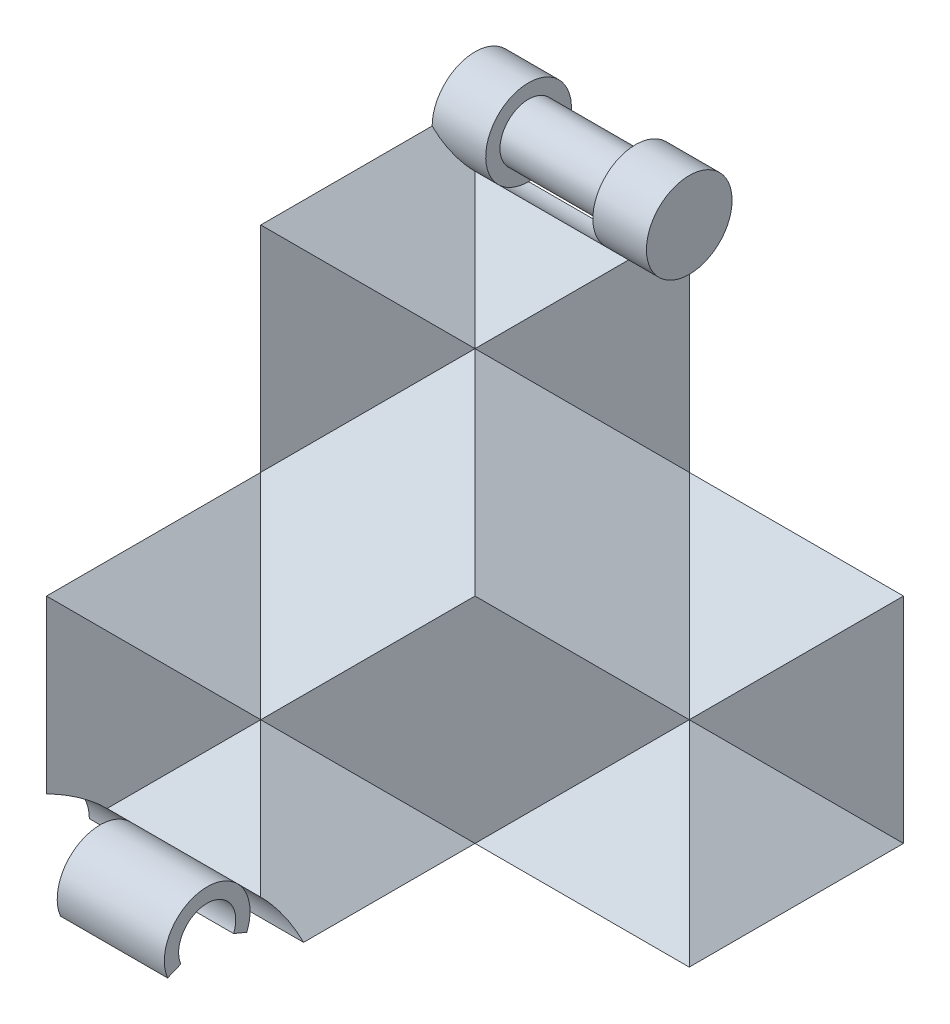
ISO-10303-21;
HEADER;
FILE_DESCRIPTION(('STEP AP214'),'2;1');
FILE_NAME('part.step','',(''),(''),'','','');
FILE_SCHEMA(('AUTOMOTIVE_DESIGN { 1 0 10303 214 1 1 1 1 }'));
ENDSEC;
DATA;
#1=APPLICATION_CONTEXT('core data for automotive mechanical design processes');
#2=APPLICATION_PROTOCOL_DEFINITION('international standard','automotive_design',2000,#1);
#3=PRODUCT_CONTEXT('',#1,'mechanical');
#4=PRODUCT('Part','Part','',(#3));
#5=PRODUCT_RELATED_PRODUCT_CATEGORY('part','',(#4));
#6=PRODUCT_DEFINITION_FORMATION('','',#4);
#7=PRODUCT_DEFINITION_CONTEXT('part definition',#1,'design');
#8=PRODUCT_DEFINITION('design','',#6,#7);
#9=PRODUCT_DEFINITION_SHAPE('','',#8);
#10=(LENGTH_UNIT() NAMED_UNIT(*) SI_UNIT(.MILLI.,.METRE.));
#11=(NAMED_UNIT(*) PLANE_ANGLE_UNIT() SI_UNIT($,.RADIAN.));
#12=(NAMED_UNIT(*) SI_UNIT($,.STERADIAN.) SOLID_ANGLE_UNIT());
#13=UNCERTAINTY_MEASURE_WITH_UNIT(LENGTH_MEASURE(1.E-05),#10,'distance_accuracy_value','');
#14=(GEOMETRIC_REPRESENTATION_CONTEXT(3) GLOBAL_UNCERTAINTY_ASSIGNED_CONTEXT((#13)) GLOBAL_UNIT_ASSIGNED_CONTEXT((#10,
#11,#12)) REPRESENTATION_CONTEXT('',''));
#15=CARTESIAN_POINT('',(0.,0.,0.));
#16=DIRECTION('',(0.,0.,1.));
#17=DIRECTION('',(1.,0.,0.));
#18=AXIS2_PLACEMENT_3D('',#15,#16,#17);
#19=CARTESIAN_POINT('',(0.,0.,0.));
#20=DIRECTION('',(0.,0.,-1.));
#21=DIRECTION('',(-1.,0.,0.));
#22=AXIS2_PLACEMENT_3D('',#19,#20,#21);
#23=PLANE('',#22);
#24=DIRECTION('',(-1.,0.,0.));
#25=VECTOR('',#24,1.);
#26=CARTESIAN_POINT('',(25.063807345283,34.29,0.));
#27=LINE('',#26,#25);
#28=CARTESIAN_POINT('',(4.7625,34.29,0.));
#29=VERTEX_POINT('',#28);
#30=CARTESIAN_POINT('',(14.2875,34.29,0.));
#31=VERTEX_POINT('',#30);
#32=EDGE_CURVE('E842',#29,#31,#27,.F.);
#33=ORIENTED_EDGE('',*,*,#32,.T.);
#34=DIRECTION('',(-1.,0.,0.));
#35=VECTOR('',#34,1.);
#36=CARTESIAN_POINT('',(19.05,34.29,0.));
#37=LINE('',#36,#35);
#38=CARTESIAN_POINT('',(19.05,34.29,0.));
#39=VERTEX_POINT('',#38);
#40=EDGE_CURVE('E69',#31,#39,#37,.F.);
#41=ORIENTED_EDGE('',*,*,#40,.T.);
#42=DIRECTION('',(0.,1.,0.));
#43=VECTOR('',#42,1.);
#44=CARTESIAN_POINT('',(19.05,19.05,0.));
#45=LINE('',#44,#43);
#46=CARTESIAN_POINT('',(19.05,19.05,0.));
#47=VERTEX_POINT('',#46);
#48=EDGE_CURVE('E224',#47,#39,#45,.T.);
#49=ORIENTED_EDGE('',*,*,#48,.F.);
#50=DIRECTION('',(-1.,0.,0.));
#51=VECTOR('',#50,1.);
#52=CARTESIAN_POINT('',(19.05,19.05,0.));
#53=LINE('',#52,#51);
#54=CARTESIAN_POINT('',(38.1,19.05,0.));
#55=VERTEX_POINT('',#54);
#56=EDGE_CURVE('E239',#55,#47,#53,.T.);
#57=ORIENTED_EDGE('',*,*,#56,.F.);
#58=DIRECTION('',(0.,1.,0.));
#59=VECTOR('',#58,1.);
#60=CARTESIAN_POINT('',(38.1,0.,0.));
#61=LINE('',#60,#59);
#62=CARTESIAN_POINT('',(38.1,0.,0.));
#63=VERTEX_POINT('',#62);
#64=EDGE_CURVE('E235',#63,#55,#61,.T.);
#65=ORIENTED_EDGE('',*,*,#64,.F.);
#66=DIRECTION('',(1.,0.,0.));
#67=VECTOR('',#66,1.);
#68=CARTESIAN_POINT('',(0.,0.,0.));
#69=LINE('',#68,#67);
#70=CARTESIAN_POINT('',(0.,0.,0.));
#71=VERTEX_POINT('',#70);
#72=EDGE_CURVE('E276',#71,#63,#69,.T.);
#73=ORIENTED_EDGE('',*,*,#72,.F.);
#74=DIRECTION('',(0.,-1.,0.));
#75=VECTOR('',#74,1.);
#76=CARTESIAN_POINT('',(0.,0.,0.));
#77=LINE('',#76,#75);
#78=CARTESIAN_POINT('',(0.,34.29,0.));
#79=VERTEX_POINT('',#78);
#80=EDGE_CURVE('E273',#79,#71,#77,.T.);
#81=ORIENTED_EDGE('',*,*,#80,.F.);
#82=DIRECTION('',(-1.,0.,0.));
#83=VECTOR('',#82,1.);
#84=CARTESIAN_POINT('',(15.538807345283,34.29,0.));
#85=LINE('',#84,#83);
#86=EDGE_CURVE('E188',#79,#29,#85,.F.);
#87=ORIENTED_EDGE('',*,*,#86,.T.);
#88=EDGE_LOOP('',(#33,#41,#49,#57,#65,#73,#81,#87));
#89=FACE_BOUND('',#88,.T.);
#90=ADVANCED_FACE('F45',(#89),#23,.T.);
#91=CARTESIAN_POINT('',(0.,38.1,0.));
#92=DIRECTION('',(0.,0.707106781186546,0.707106781186549));
#93=DIRECTION('',(0.,-0.707106781186549,0.707106781186546));
#94=AXIS2_PLACEMENT_3D('',#91,#92,#93);
#95=PLANE('',#94);
#96=DIRECTION('',(-1.,0.,0.));
#97=VECTOR('',#96,1.);
#98=CARTESIAN_POINT('',(19.05,35.4059231636793,2.69407683632078));
#99=LINE('',#98,#97);
#100=CARTESIAN_POINT('',(14.2875,35.4059231636793,2.69407683632077));
#101=VERTEX_POINT('',#100);
#102=CARTESIAN_POINT('',(16.3559231636792,35.4059231636793,2.69407683632078));
#103=VERTEX_POINT('',#102);
#104=EDGE_CURVE('E822',#101,#103,#99,.F.);
#105=ORIENTED_EDGE('',*,*,#104,.F.);
#106=DIRECTION('',(-1.,0.,0.));
#107=VECTOR('',#106,1.);
#108=CARTESIAN_POINT('',(25.063807345283,35.4059231636793,2.69407683632077));
#109=LINE('',#108,#107);
#110=CARTESIAN_POINT('',(4.7625,35.4059231636793,2.69407683632077));
#111=VERTEX_POINT('',#110);
#112=EDGE_CURVE('E11',#111,#101,#109,.F.);
#113=ORIENTED_EDGE('',*,*,#112,.F.);
#114=DIRECTION('',(-1.,0.,0.));
#115=VECTOR('',#114,1.);
#116=CARTESIAN_POINT('',(15.538807345283,35.4059231636793,2.69407683632078));
#117=LINE('',#116,#115);
#118=CARTESIAN_POINT('',(2.69407683632075,35.4059231636793,2.69407683632078));
#119=VERTEX_POINT('',#118);
#120=EDGE_CURVE('E203',#119,#111,#117,.F.);
#121=ORIENTED_EDGE('',*,*,#120,.F.);
#122=DIRECTION('',(-0.577350269189627,0.577350269189627,-0.577350269189624));
#123=VECTOR('',#122,1.);
#124=CARTESIAN_POINT('',(6.35000000000001,31.75,6.35000000000003));
#125=LINE('',#124,#123);
#126=CARTESIAN_POINT('',(9.525,28.575,9.525));
#127=VERTEX_POINT('',#126);
#128=EDGE_CURVE('E201',#127,#119,#125,.T.);
#129=ORIENTED_EDGE('',*,*,#128,.F.);
#130=DIRECTION('',(0.577350269189627,0.577350269189627,-0.577350269189624));
#131=VECTOR('',#130,1.);
#132=CARTESIAN_POINT('',(12.7,31.75,6.35000000000003));
#133=LINE('',#132,#131);
#134=EDGE_CURVE('E210',#127,#103,#133,.T.);
#135=ORIENTED_EDGE('',*,*,#134,.T.);
#136=EDGE_LOOP('',(#105,#113,#121,#129,#135));
#137=FACE_BOUND('',#136,.T.);
#138=ADVANCED_FACE('F425',(#137),#95,.T.);
#139=CARTESIAN_POINT('',(19.05,19.05,0.));
#140=DIRECTION('',(0.707106781186546,0.,0.707106781186549));
#141=DIRECTION('',(0.707106781186549,0.,-0.707106781186546));
#142=AXIS2_PLACEMENT_3D('',#139,#140,#141);
#143=PLANE('',#142);
#144=CARTESIAN_POINT('',(19.05,38.1,0.));
#145=DIRECTION('',(0.707106781186546,0.,0.707106781186549));
#146=DIRECTION('',(-0.707106781186549,0.,0.707106781186546));
#147=AXIS2_PLACEMENT_3D('',#144,#145,#146);
#148=ELLIPSE('',#147,5.3881536726415,3.81);
#149=EDGE_CURVE('E61',#103,#39,#148,.T.);
#150=ORIENTED_EDGE('',*,*,#149,.F.);
#151=ORIENTED_EDGE('',*,*,#134,.F.);
#152=DIRECTION('',(0.577350269189627,-0.577350269189626,-0.577350269189625));
#153=VECTOR('',#152,1.);
#154=CARTESIAN_POINT('',(12.7,25.4000000000001,6.35000000000003));
#155=LINE('',#154,#153);
#156=EDGE_CURVE('E215',#127,#47,#155,.T.);
#157=ORIENTED_EDGE('',*,*,#156,.T.);
#158=ORIENTED_EDGE('',*,*,#48,.T.);
#159=EDGE_LOOP('',(#150,#151,#157,#158));
#160=FACE_BOUND('',#159,.T.);
#161=ADVANCED_FACE('F428',(#160),#143,.T.);
#162=CARTESIAN_POINT('',(0.,38.1,19.05));
#163=DIRECTION('',(0.707106781186549,0.707106781186546,0.));
#164=DIRECTION('',(0.707106781186546,-0.707106781186549,0.));
#165=AXIS2_PLACEMENT_3D('',#162,#163,#164);
#166=PLANE('',#165);
#167=CARTESIAN_POINT('',(0.,38.1,0.));
#168=DIRECTION('',(0.707106781186549,0.707106781186546,0.));
#169=DIRECTION('',(-0.707106781186546,0.707106781186549,0.));
#170=AXIS2_PLACEMENT_3D('',#167,#168,#169);
#171=ELLIPSE('',#170,5.38815367264148,3.81);
#172=CARTESIAN_POINT('',(0.,38.1,3.81000000000003));
#173=VERTEX_POINT('',#172);
#174=EDGE_CURVE('E185',#173,#119,#171,.T.);
#175=ORIENTED_EDGE('',*,*,#174,.F.);
#176=DIRECTION('',(0.,0.,1.));
#177=VECTOR('',#176,1.);
#178=CARTESIAN_POINT('',(0.,38.1,19.05));
#179=LINE('',#178,#177);
#180=CARTESIAN_POINT('',(0.,38.1,19.05));
#181=VERTEX_POINT('',#180);
#182=EDGE_CURVE('E198',#173,#181,#179,.T.);
#183=ORIENTED_EDGE('',*,*,#182,.T.);
#184=DIRECTION('',(-0.577350269189622,0.577350269189627,0.577350269189629));
#185=VECTOR('',#184,1.);
#186=CARTESIAN_POINT('',(6.35000000000004,31.75,12.7));
#187=LINE('',#186,#185);
#188=EDGE_CURVE('E240',#127,#181,#187,.T.);
#189=ORIENTED_EDGE('',*,*,#188,.F.);
#190=ORIENTED_EDGE('',*,*,#128,.T.);
#191=EDGE_LOOP('',(#175,#183,#189,#190));
#192=FACE_BOUND('',#191,.T.);
#193=ADVANCED_FACE('F197',(#192),#166,.T.);
#194=CARTESIAN_POINT('',(0.,0.,38.1));
#195=DIRECTION('',(0.,0.707106781186551,0.707106781186544));
#196=DIRECTION('',(0.,-0.707106781186544,0.707106781186551));
#197=AXIS2_PLACEMENT_3D('',#194,#195,#196);
#198=PLANE('',#197);
#199=DIRECTION('',(-1.,0.,0.));
#200=VECTOR('',#199,1.);
#201=CARTESIAN_POINT('',(19.05,2.6940768363208,35.4059231636792));
#202=LINE('',#201,#200);
#203=CARTESIAN_POINT('',(16.3559231636793,2.6940768363208,35.4059231636792));
#204=VERTEX_POINT('',#203);
#205=CARTESIAN_POINT('',(14.2875,2.69407683632081,35.4059231636792));
#206=VERTEX_POINT('',#205);
#207=EDGE_CURVE('E413',#204,#206,#202,.T.);
#208=ORIENTED_EDGE('',*,*,#207,.F.);
#209=DIRECTION('',(0.577350269189627,-0.577350269189622,0.577350269189629));
#210=VECTOR('',#209,1.);
#211=CARTESIAN_POINT('',(19.05,0.,38.1));
#212=LINE('',#211,#210);
#213=CARTESIAN_POINT('',(9.525,9.525,28.575));
#214=VERTEX_POINT('',#213);
#215=EDGE_CURVE('E294',#214,#204,#212,.T.);
#216=ORIENTED_EDGE('',*,*,#215,.F.);
#217=DIRECTION('',(-0.577350269189627,-0.577350269189622,0.577350269189629));
#218=VECTOR('',#217,1.);
#219=CARTESIAN_POINT('',(0.,0.,38.1));
#220=LINE('',#219,#218);
#221=CARTESIAN_POINT('',(2.69407683632077,2.69407683632082,35.4059231636792));
#222=VERTEX_POINT('',#221);
#223=EDGE_CURVE('E300',#214,#222,#220,.T.);
#224=ORIENTED_EDGE('',*,*,#223,.T.);
#225=DIRECTION('',(-1.,0.,0.));
#226=VECTOR('',#225,1.);
#227=CARTESIAN_POINT('',(15.538807345283,2.6940768363208,35.4059231636792));
#228=LINE('',#227,#226);
#229=CARTESIAN_POINT('',(4.7625,2.69407683632081,35.4059231636792));
#230=VERTEX_POINT('',#229);
#231=EDGE_CURVE('E873',#230,#222,#228,.T.);
#232=ORIENTED_EDGE('',*,*,#231,.F.);
#233=DIRECTION('',(-1.,0.,0.));
#234=VECTOR('',#233,1.);
#235=CARTESIAN_POINT('',(14.2875,2.6940768363208,35.4059231636792));
#236=LINE('',#235,#234);
#237=EDGE_CURVE('E229',#206,#230,#236,.T.);
#238=ORIENTED_EDGE('',*,*,#237,.F.);
#239=EDGE_LOOP('',(#208,#216,#224,#232,#238));
#240=FACE_BOUND('',#239,.T.);
#241=ADVANCED_FACE('F412',(#240),#198,.T.);
#242=CARTESIAN_POINT('',(0.,0.,38.1));
#243=DIRECTION('',(0.,-1.,0.));
#244=DIRECTION('',(-1.,0.,0.));
#245=AXIS2_PLACEMENT_3D('',#242,#243,#244);
#246=PLANE('',#245);
#247=DIRECTION('',(0.,0.,-1.));
#248=VECTOR('',#247,1.);
#249=CARTESIAN_POINT('',(19.05,0.,38.1));
#250=LINE('',#249,#248);
#251=CARTESIAN_POINT('',(19.05,0.,34.29));
#252=VERTEX_POINT('',#251);
#253=CARTESIAN_POINT('',(19.05,0.,19.05));
#254=VERTEX_POINT('',#253);
#255=EDGE_CURVE('E284',#252,#254,#250,.T.);
#256=ORIENTED_EDGE('',*,*,#255,.F.);
#257=DIRECTION('',(-1.,0.,0.));
#258=VECTOR('',#257,1.);
#259=CARTESIAN_POINT('',(19.05,0.,34.29));
#260=LINE('',#259,#258);
#261=CARTESIAN_POINT('',(14.2875,0.,34.29));
#262=VERTEX_POINT('',#261);
#263=EDGE_CURVE('E326',#252,#262,#260,.T.);
#264=ORIENTED_EDGE('',*,*,#263,.T.);
#265=DIRECTION('',(-1.,0.,0.));
#266=VECTOR('',#265,1.);
#267=CARTESIAN_POINT('',(14.2875,0.,34.29));
#268=LINE('',#267,#266);
#269=CARTESIAN_POINT('',(4.7625,0.,34.29));
#270=VERTEX_POINT('',#269);
#271=EDGE_CURVE('E54',#262,#270,#268,.T.);
#272=ORIENTED_EDGE('',*,*,#271,.T.);
#273=DIRECTION('',(-1.,0.,0.));
#274=VECTOR('',#273,1.);
#275=CARTESIAN_POINT('',(15.538807345283,0.,34.29));
#276=LINE('',#275,#274);
#277=CARTESIAN_POINT('',(0.,0.,34.29));
#278=VERTEX_POINT('',#277);
#279=EDGE_CURVE('E325',#270,#278,#276,.T.);
#280=ORIENTED_EDGE('',*,*,#279,.T.);
#281=DIRECTION('',(0.,0.,1.));
#282=VECTOR('',#281,1.);
#283=CARTESIAN_POINT('',(0.,0.,38.1));
#284=LINE('',#283,#282);
#285=EDGE_CURVE('E290',#71,#278,#284,.T.);
#286=ORIENTED_EDGE('',*,*,#285,.F.);
#287=ORIENTED_EDGE('',*,*,#72,.T.);
#288=DIRECTION('',(0.,0.,-1.));
#289=VECTOR('',#288,1.);
#290=CARTESIAN_POINT('',(38.1,0.,19.05));
#291=LINE('',#290,#289);
#292=CARTESIAN_POINT('',(38.1,0.,19.05));
#293=VERTEX_POINT('',#292);
#294=EDGE_CURVE('E248',#293,#63,#291,.T.);
#295=ORIENTED_EDGE('',*,*,#294,.F.);
#296=DIRECTION('',(1.,0.,0.));
#297=VECTOR('',#296,1.);
#298=CARTESIAN_POINT('',(19.05,0.,19.05));
#299=LINE('',#298,#297);
#300=EDGE_CURVE('E255',#254,#293,#299,.T.);
#301=ORIENTED_EDGE('',*,*,#300,.F.);
#302=EDGE_LOOP('',(#256,#264,#272,#280,#286,#287,#295,#301));
#303=FACE_BOUND('',#302,.T.);
#304=ADVANCED_FACE('F323',(#303),#246,.T.);
#305=CARTESIAN_POINT('',(19.05,0.,38.1));
#306=DIRECTION('',(0.707106781186546,0.707106781186549,0.));
#307=DIRECTION('',(0.707106781186549,-0.707106781186546,0.));
#308=AXIS2_PLACEMENT_3D('',#305,#306,#307);
#309=PLANE('',#308);
#310=CARTESIAN_POINT('',(19.05,0.,38.1));
#311=DIRECTION('',(0.707106781186546,0.707106781186549,0.));
#312=DIRECTION('',(-0.707106781186549,0.707106781186546,0.));
#313=AXIS2_PLACEMENT_3D('',#310,#311,#312);
#314=ELLIPSE('',#313,5.3881536726415,3.81);
#315=EDGE_CURVE('E858',#252,#204,#314,.T.);
#316=ORIENTED_EDGE('',*,*,#315,.F.);
#317=ORIENTED_EDGE('',*,*,#255,.T.);
#318=DIRECTION('',(0.577350269189627,-0.577350269189626,-0.577350269189625));
#319=VECTOR('',#318,1.);
#320=CARTESIAN_POINT('',(12.7,6.35000000000002,25.4));
#321=LINE('',#320,#319);
#322=EDGE_CURVE('E295',#214,#254,#321,.T.);
#323=ORIENTED_EDGE('',*,*,#322,.F.);
#324=ORIENTED_EDGE('',*,*,#215,.T.);
#325=EDGE_LOOP('',(#316,#317,#323,#324));
#326=FACE_BOUND('',#325,.T.);
#327=ADVANCED_FACE('F416',(#326),#309,.T.);
#328=CARTESIAN_POINT('',(0.,0.,38.1));
#329=DIRECTION('',(0.707106781186551,0.,0.707106781186544));
#330=DIRECTION('',(0.707106781186544,0.,-0.707106781186551));
#331=AXIS2_PLACEMENT_3D('',#328,#329,#330);
#332=PLANE('',#331);
#333=CARTESIAN_POINT('',(0.,0.,38.1));
#334=DIRECTION('',(0.707106781186551,0.,0.707106781186544));
#335=DIRECTION('',(-0.707106781186544,0.,0.707106781186551));
#336=AXIS2_PLACEMENT_3D('',#333,#334,#335);
#337=ELLIPSE('',#336,5.38815367264147,3.81);
#338=CARTESIAN_POINT('',(0.,3.81000000000007,38.1));
#339=VERTEX_POINT('',#338);
#340=EDGE_CURVE('E407',#222,#339,#337,.T.);
#341=ORIENTED_EDGE('',*,*,#340,.F.);
#342=ORIENTED_EDGE('',*,*,#223,.F.);
#343=DIRECTION('',(-0.577350269189622,0.577350269189627,0.577350269189629));
#344=VECTOR('',#343,1.);
#345=CARTESIAN_POINT('',(6.35000000000004,12.7,31.75));
#346=LINE('',#345,#344);
#347=CARTESIAN_POINT('',(0.,19.05,38.1));
#348=VERTEX_POINT('',#347);
#349=EDGE_CURVE('E314',#214,#348,#346,.T.);
#350=ORIENTED_EDGE('',*,*,#349,.T.);
#351=DIRECTION('',(0.,-1.,0.));
#352=VECTOR('',#351,1.);
#353=CARTESIAN_POINT('',(0.,0.,38.1));
#354=LINE('',#353,#352);
#355=EDGE_CURVE('E310',#348,#339,#354,.T.);
#356=ORIENTED_EDGE('',*,*,#355,.T.);
#357=EDGE_LOOP('',(#341,#342,#350,#356));
#358=FACE_BOUND('',#357,.T.);
#359=ADVANCED_FACE('F406',(#358),#332,.T.);
#360=CARTESIAN_POINT('',(19.05,0.,19.05));
#361=DIRECTION('',(0.707106781186546,0.,0.707106781186549));
#362=DIRECTION('',(0.707106781186549,0.,-0.707106781186546));
#363=AXIS2_PLACEMENT_3D('',#360,#361,#362);
#364=PLANE('',#363);
#365=ORIENTED_EDGE('',*,*,#322,.T.);
#366=DIRECTION('',(-0.577350269189627,-0.577350269189622,0.577350269189629));
#367=VECTOR('',#366,1.);
#368=CARTESIAN_POINT('',(19.05,0.,19.05));
#369=LINE('',#368,#367);
#370=CARTESIAN_POINT('',(28.575,9.525,9.525));
#371=VERTEX_POINT('',#370);
#372=EDGE_CURVE('E265',#371,#254,#369,.T.);
#373=ORIENTED_EDGE('',*,*,#372,.F.);
#374=DIRECTION('',(-0.577350269189622,0.577350269189627,0.577350269189629));
#375=VECTOR('',#374,1.);
#376=CARTESIAN_POINT('',(25.4000000000001,12.7,12.7));
#377=LINE('',#376,#375);
#378=CARTESIAN_POINT('',(19.05,19.05,19.05));
#379=VERTEX_POINT('',#378);
#380=EDGE_CURVE('E264',#371,#379,#377,.T.);
#381=ORIENTED_EDGE('',*,*,#380,.T.);
#382=DIRECTION('',(0.577350269189627,0.577350269189627,-0.577350269189624));
#383=VECTOR('',#382,1.);
#384=CARTESIAN_POINT('',(12.7,12.7,25.4));
#385=LINE('',#384,#383);
#386=EDGE_CURVE('E280',#214,#379,#385,.T.);
#387=ORIENTED_EDGE('',*,*,#386,.F.);
#388=EDGE_LOOP('',(#365,#373,#381,#387));
#389=FACE_BOUND('',#388,.T.);
#390=ADVANCED_FACE('F419',(#389),#364,.T.);
#391=CARTESIAN_POINT('',(0.,19.05,19.05));
#392=DIRECTION('',(0.,0.707106781186546,0.707106781186549));
#393=DIRECTION('',(0.,-0.707106781186549,0.707106781186546));
#394=AXIS2_PLACEMENT_3D('',#391,#392,#393);
#395=PLANE('',#394);
#396=ORIENTED_EDGE('',*,*,#386,.T.);
#397=DIRECTION('',(0.577350269189627,-0.577350269189622,0.577350269189629));
#398=VECTOR('',#397,1.);
#399=CARTESIAN_POINT('',(19.05,19.0500000000001,19.05));
#400=LINE('',#399,#398);
#401=EDGE_CURVE('E225',#127,#379,#400,.T.);
#402=ORIENTED_EDGE('',*,*,#401,.F.);
#403=DIRECTION('',(-0.577350269189627,-0.577350269189622,0.577350269189629));
#404=VECTOR('',#403,1.);
#405=CARTESIAN_POINT('',(0.,19.0500000000001,19.05));
#406=LINE('',#405,#404);
#407=CARTESIAN_POINT('',(0.,19.05,19.05));
#408=VERTEX_POINT('',#407);
#409=EDGE_CURVE('E220',#127,#408,#406,.T.);
#410=ORIENTED_EDGE('',*,*,#409,.T.);
#411=DIRECTION('',(-0.577350269189627,0.577350269189627,-0.577350269189624));
#412=VECTOR('',#411,1.);
#413=CARTESIAN_POINT('',(6.35000000000002,12.7,25.4));
#414=LINE('',#413,#412);
#415=EDGE_CURVE('E279',#214,#408,#414,.T.);
#416=ORIENTED_EDGE('',*,*,#415,.F.);
#417=EDGE_LOOP('',(#396,#402,#410,#416));
#418=FACE_BOUND('',#417,.T.);
#419=ADVANCED_FACE('F396',(#418),#395,.T.);
#420=CARTESIAN_POINT('',(0.,19.05,38.1));
#421=DIRECTION('',(0.707106781186549,0.707106781186546,0.));
#422=DIRECTION('',(0.707106781186546,-0.707106781186549,0.));
#423=AXIS2_PLACEMENT_3D('',#420,#421,#422);
#424=PLANE('',#423);
#425=DIRECTION('',(0.,0.,1.));
#426=VECTOR('',#425,1.);
#427=CARTESIAN_POINT('',(0.,19.05,38.1));
#428=LINE('',#427,#426);
#429=EDGE_CURVE('E299',#408,#348,#428,.T.);
#430=ORIENTED_EDGE('',*,*,#429,.T.);
#431=ORIENTED_EDGE('',*,*,#349,.F.);
#432=ORIENTED_EDGE('',*,*,#415,.T.);
#433=EDGE_LOOP('',(#430,#431,#432));
#434=FACE_BOUND('',#433,.T.);
#435=ADVANCED_FACE('F47',(#434),#424,.T.);
#436=CARTESIAN_POINT('',(0.,0.,38.1));
#437=DIRECTION('',(-1.,0.,0.));
#438=DIRECTION('',(0.,0.,1.));
#439=AXIS2_PLACEMENT_3D('',#436,#437,#438);
#440=PLANE('',#439);
#441=CARTESIAN_POINT('',(0.,38.1,0.));
#442=DIRECTION('',(1.,0.,0.));
#443=DIRECTION('',(0.,0.,-1.));
#444=AXIS2_PLACEMENT_3D('',#441,#442,#443);
#445=CIRCLE('',#444,3.81);
#446=EDGE_CURVE('E182',#79,#173,#445,.T.);
#447=ORIENTED_EDGE('',*,*,#446,.F.);
#448=ORIENTED_EDGE('',*,*,#80,.T.);
#449=ORIENTED_EDGE('',*,*,#285,.T.);
#450=CARTESIAN_POINT('',(0.,0.,38.1));
#451=DIRECTION('',(1.,0.,0.));
#452=DIRECTION('',(0.,0.,-1.));
#453=AXIS2_PLACEMENT_3D('',#450,#451,#452);
#454=CIRCLE('',#453,3.81);
#455=EDGE_CURVE('E865',#278,#339,#454,.T.);
#456=ORIENTED_EDGE('',*,*,#455,.T.);
#457=ORIENTED_EDGE('',*,*,#355,.F.);
#458=ORIENTED_EDGE('',*,*,#429,.F.);
#459=DIRECTION('',(0.,-1.,0.));
#460=VECTOR('',#459,1.);
#461=CARTESIAN_POINT('',(0.,19.05,19.05));
#462=LINE('',#461,#460);
#463=EDGE_CURVE('E208',#181,#408,#462,.T.);
#464=ORIENTED_EDGE('',*,*,#463,.F.);
#465=ORIENTED_EDGE('',*,*,#182,.F.);
#466=EDGE_LOOP('',(#447,#448,#449,#456,#457,#458,#464,#465));
#467=FACE_BOUND('',#466,.T.);
#468=ADVANCED_FACE('F206',(#467),#440,.T.);
#469=CARTESIAN_POINT('',(38.1,0.,19.05));
#470=DIRECTION('',(0.707106781186546,0.707106781186549,0.));
#471=DIRECTION('',(0.707106781186549,-0.707106781186546,0.));
#472=AXIS2_PLACEMENT_3D('',#469,#470,#471);
#473=PLANE('',#472);
#474=ORIENTED_EDGE('',*,*,#294,.T.);
#475=DIRECTION('',(0.577350269189627,-0.577350269189626,-0.577350269189625));
#476=VECTOR('',#475,1.);
#477=CARTESIAN_POINT('',(31.75,6.35000000000002,6.35000000000003));
#478=LINE('',#477,#476);
#479=EDGE_CURVE('E260',#371,#63,#478,.T.);
#480=ORIENTED_EDGE('',*,*,#479,.F.);
#481=DIRECTION('',(0.577350269189627,-0.577350269189622,0.577350269189629));
#482=VECTOR('',#481,1.);
#483=CARTESIAN_POINT('',(38.1,0.,19.05));
#484=LINE('',#483,#482);
#485=EDGE_CURVE('E259',#371,#293,#484,.T.);
#486=ORIENTED_EDGE('',*,*,#485,.T.);
#487=EDGE_LOOP('',(#474,#480,#486));
#488=FACE_BOUND('',#487,.T.);
#489=ADVANCED_FACE('F456',(#488),#473,.T.);
#490=CARTESIAN_POINT('',(19.05,0.,19.05));
#491=DIRECTION('',(0.,0.707106781186551,0.707106781186544));
#492=DIRECTION('',(0.,-0.707106781186544,0.707106781186551));
#493=AXIS2_PLACEMENT_3D('',#490,#491,#492);
#494=PLANE('',#493);
#495=ORIENTED_EDGE('',*,*,#300,.T.);
#496=ORIENTED_EDGE('',*,*,#485,.F.);
#497=ORIENTED_EDGE('',*,*,#372,.T.);
#498=EDGE_LOOP('',(#495,#496,#497));
#499=FACE_BOUND('',#498,.T.);
#500=ADVANCED_FACE('F488',(#499),#494,.T.);
#501=CARTESIAN_POINT('',(38.1,0.,0.));
#502=DIRECTION('',(0.707106781186546,0.,0.707106781186549));
#503=DIRECTION('',(0.707106781186549,0.,-0.707106781186546));
#504=AXIS2_PLACEMENT_3D('',#501,#502,#503);
#505=PLANE('',#504);
#506=ORIENTED_EDGE('',*,*,#64,.T.);
#507=DIRECTION('',(0.577350269189627,0.577350269189627,-0.577350269189624));
#508=VECTOR('',#507,1.);
#509=CARTESIAN_POINT('',(31.75,12.7,6.35000000000003));
#510=LINE('',#509,#508);
#511=EDGE_CURVE('E244',#371,#55,#510,.T.);
#512=ORIENTED_EDGE('',*,*,#511,.F.);
#513=ORIENTED_EDGE('',*,*,#479,.T.);
#514=EDGE_LOOP('',(#506,#512,#513));
#515=FACE_BOUND('',#514,.T.);
#516=ADVANCED_FACE('F495',(#515),#505,.T.);
#517=CARTESIAN_POINT('',(19.05,19.05,0.));
#518=DIRECTION('',(0.,0.707106781186546,0.707106781186549));
#519=DIRECTION('',(0.,-0.707106781186549,0.707106781186546));
#520=AXIS2_PLACEMENT_3D('',#517,#518,#519);
#521=PLANE('',#520);
#522=ORIENTED_EDGE('',*,*,#56,.T.);
#523=DIRECTION('',(-0.577350269189627,0.577350269189627,-0.577350269189624));
#524=VECTOR('',#523,1.);
#525=CARTESIAN_POINT('',(25.4000000000001,12.7,6.35000000000003));
#526=LINE('',#525,#524);
#527=EDGE_CURVE('E243',#371,#47,#526,.T.);
#528=ORIENTED_EDGE('',*,*,#527,.F.);
#529=ORIENTED_EDGE('',*,*,#511,.T.);
#530=EDGE_LOOP('',(#522,#528,#529));
#531=FACE_BOUND('',#530,.T.);
#532=ADVANCED_FACE('F501',(#531),#521,.T.);
#533=CARTESIAN_POINT('',(19.0500000000001,19.05,19.05));
#534=DIRECTION('',(0.707106781186549,0.707106781186546,0.));
#535=DIRECTION('',(0.707106781186546,-0.707106781186549,0.));
#536=AXIS2_PLACEMENT_3D('',#533,#534,#535);
#537=PLANE('',#536);
#538=ORIENTED_EDGE('',*,*,#527,.T.);
#539=ORIENTED_EDGE('',*,*,#156,.F.);
#540=ORIENTED_EDGE('',*,*,#401,.T.);
#541=ORIENTED_EDGE('',*,*,#380,.F.);
#542=EDGE_LOOP('',(#538,#539,#540,#541));
#543=FACE_BOUND('',#542,.T.);
#544=ADVANCED_FACE('F422',(#543),#537,.T.);
#545=CARTESIAN_POINT('',(0.,19.05,19.05));
#546=DIRECTION('',(0.707106781186551,0.,0.707106781186544));
#547=DIRECTION('',(0.707106781186544,0.,-0.707106781186551));
#548=AXIS2_PLACEMENT_3D('',#545,#546,#547);
#549=PLANE('',#548);
#550=ORIENTED_EDGE('',*,*,#463,.T.);
#551=ORIENTED_EDGE('',*,*,#409,.F.);
#552=ORIENTED_EDGE('',*,*,#188,.T.);
#553=EDGE_LOOP('',(#550,#551,#552));
#554=FACE_BOUND('',#553,.T.);
#555=ADVANCED_FACE('F392',(#554),#549,.T.);
#556=CARTESIAN_POINT('',(14.2875,-13.4703841816037,5.57961581839623));
#557=DIRECTION('',(0.,-0.923879532511287,0.382683432365089));
#558=DIRECTION('',(0.,-0.382683432365089,-0.923879532511287));
#559=AXIS2_PLACEMENT_3D('',#556,#557,#558);
#560=PLANE('',#559);
#561=DIRECTION('',(0.,0.382683432365089,0.923879532511287));
#562=VECTOR('',#561,1.);
#563=CARTESIAN_POINT('',(4.7625,-13.4703841816037,5.57961581839623));
#564=LINE('',#563,#562);
#565=CARTESIAN_POINT('',(4.7625,-1.45802387731092,34.580018981132));
#566=VERTEX_POINT('',#565);
#567=CARTESIAN_POINT('',(4.7625,-0.972015918207258,35.7533459874213));
#568=VERTEX_POINT('',#567);
#569=EDGE_CURVE('E358',#566,#568,#564,.T.);
#570=ORIENTED_EDGE('',*,*,#569,.F.);
#571=DIRECTION('',(-1.,0.,0.));
#572=VECTOR('',#571,1.);
#573=CARTESIAN_POINT('',(14.2875,-1.45802387731092,34.580018981132));
#574=LINE('',#573,#572);
#575=CARTESIAN_POINT('',(14.2875,-1.45802387731092,34.580018981132));
#576=VERTEX_POINT('',#575);
#577=EDGE_CURVE('E383',#576,#566,#574,.T.);
#578=ORIENTED_EDGE('',*,*,#577,.F.);
#579=DIRECTION('',(0.,0.382683432365089,0.923879532511287));
#580=VECTOR('',#579,1.);
#581=CARTESIAN_POINT('',(14.2875,-13.4703841816037,5.57961581839623));
#582=LINE('',#581,#580);
#583=CARTESIAN_POINT('',(14.2875,-0.972015918207258,35.7533459874213));
#584=VERTEX_POINT('',#583);
#585=EDGE_CURVE('E342',#576,#584,#582,.T.);
#586=ORIENTED_EDGE('',*,*,#585,.T.);
#587=DIRECTION('',(-1.,0.,0.));
#588=VECTOR('',#587,1.);
#589=CARTESIAN_POINT('',(14.2875,-0.972015918207258,35.7533459874213));
#590=LINE('',#589,#588);
#591=EDGE_CURVE('E357',#584,#568,#590,.T.);
#592=ORIENTED_EDGE('',*,*,#591,.T.);
#593=EDGE_LOOP('',(#570,#578,#586,#592));
#594=FACE_BOUND('',#593,.T.);
#595=ADVANCED_FACE('F517',(#594),#560,.T.);
#596=CARTESIAN_POINT('',(14.2875,0.,38.1));
#597=DIRECTION('',(-1.,0.,0.));
#598=DIRECTION('',(0.,0.,1.));
#599=AXIS2_PLACEMENT_3D('',#596,#597,#598);
#600=CYLINDRICAL_SURFACE('',#599,3.81);
#601=ORIENTED_EDGE('',*,*,#271,.F.);
#602=CARTESIAN_POINT('',(14.2875,0.,38.1));
#603=DIRECTION('',(1.,0.,0.));
#604=DIRECTION('',(0.,0.,-1.));
#605=AXIS2_PLACEMENT_3D('',#602,#603,#604);
#606=CIRCLE('',#605,3.81);
#607=EDGE_CURVE('E332',#576,#262,#606,.T.);
#608=ORIENTED_EDGE('',*,*,#607,.F.);
#609=ORIENTED_EDGE('',*,*,#577,.T.);
#610=CARTESIAN_POINT('',(4.7625,0.,38.1));
#611=DIRECTION('',(1.,0.,0.));
#612=DIRECTION('',(0.,0.,-1.));
#613=AXIS2_PLACEMENT_3D('',#610,#611,#612);
#614=CIRCLE('',#613,3.81);
#615=EDGE_CURVE('E335',#566,#270,#614,.T.);
#616=ORIENTED_EDGE('',*,*,#615,.T.);
#617=EDGE_LOOP('',(#601,#608,#609,#616));
#618=FACE_BOUND('',#617,.T.);
#619=ADVANCED_FACE('F331',(#618),#600,.T.);
#620=CARTESIAN_POINT('',(14.2875,-1.4580238773109,41.619981018868));
#621=VERTEX_POINT('',#620);
#622=EDGE_CURVE('E345',#206,#621,#606,.T.);
#623=ORIENTED_EDGE('',*,*,#622,.F.);
#624=ORIENTED_EDGE('',*,*,#237,.T.);
#625=CARTESIAN_POINT('',(4.7625,-1.4580238773109,41.619981018868));
#626=VERTEX_POINT('',#625);
#627=EDGE_CURVE('E362',#230,#626,#614,.T.);
#628=ORIENTED_EDGE('',*,*,#627,.T.);
#629=DIRECTION('',(-1.,0.,0.));
#630=VECTOR('',#629,1.);
#631=CARTESIAN_POINT('',(14.2875,-1.4580238773109,41.619981018868));
#632=LINE('',#631,#630);
#633=EDGE_CURVE('E379',#621,#626,#632,.T.);
#634=ORIENTED_EDGE('',*,*,#633,.F.);
#635=EDGE_LOOP('',(#623,#624,#628,#634));
#636=FACE_BOUND('',#635,.T.);
#637=ADVANCED_FACE('F530',(#636),#600,.T.);
#638=CARTESIAN_POINT('',(14.2875,0.,38.1));
#639=DIRECTION('',(-1.,0.,0.));
#640=DIRECTION('',(0.,0.,1.));
#641=AXIS2_PLACEMENT_3D('',#638,#639,#640);
#642=CYLINDRICAL_SURFACE('',#641,2.54);
#643=CARTESIAN_POINT('',(4.7625,0.,38.1));
#644=DIRECTION('',(1.,0.,0.));
#645=DIRECTION('',(0.,0.,-1.));
#646=AXIS2_PLACEMENT_3D('',#643,#644,#645);
#647=CIRCLE('',#646,2.54);
#648=CARTESIAN_POINT('',(4.7625,-0.972015918207239,40.4466540125787));
#649=VERTEX_POINT('',#648);
#650=EDGE_CURVE('E369',#568,#649,#647,.T.);
#651=ORIENTED_EDGE('',*,*,#650,.F.);
#652=ORIENTED_EDGE('',*,*,#591,.F.);
#653=CARTESIAN_POINT('',(14.2875,0.,38.1));
#654=DIRECTION('',(1.,0.,0.));
#655=DIRECTION('',(0.,0.,-1.));
#656=AXIS2_PLACEMENT_3D('',#653,#654,#655);
#657=CIRCLE('',#656,2.54);
#658=CARTESIAN_POINT('',(14.2875,-0.972015918207239,40.4466540125787));
#659=VERTEX_POINT('',#658);
#660=EDGE_CURVE('E350',#584,#659,#657,.T.);
#661=ORIENTED_EDGE('',*,*,#660,.T.);
#662=DIRECTION('',(-1.,0.,0.));
#663=VECTOR('',#662,1.);
#664=CARTESIAN_POINT('',(14.2875,-0.972015918207239,40.4466540125787));
#665=LINE('',#664,#663);
#666=EDGE_CURVE('E375',#659,#649,#665,.T.);
#667=ORIENTED_EDGE('',*,*,#666,.T.);
#668=EDGE_LOOP('',(#651,#652,#661,#667));
#669=FACE_BOUND('',#668,.T.);
#670=ADVANCED_FACE('F537',(#669),#642,.F.);
#671=CARTESIAN_POINT('',(14.2875,0.,0.));
#672=DIRECTION('',(1.,0.,0.));
#673=DIRECTION('',(0.,0.,-1.));
#674=AXIS2_PLACEMENT_3D('',#671,#672,#673);
#675=PLANE('',#674);
#676=ORIENTED_EDGE('',*,*,#660,.F.);
#677=ORIENTED_EDGE('',*,*,#585,.F.);
#678=ORIENTED_EDGE('',*,*,#607,.T.);
#679=CARTESIAN_POINT('',(14.2875,0.,38.1));
#680=DIRECTION('',(1.,0.,0.));
#681=DIRECTION('',(0.,0.,-1.));
#682=AXIS2_PLACEMENT_3D('',#679,#680,#681);
#683=CIRCLE('',#682,3.81);
#684=EDGE_CURVE('E339',#262,#206,#683,.T.);
#685=ORIENTED_EDGE('',*,*,#684,.T.);
#686=ORIENTED_EDGE('',*,*,#622,.T.);
#687=DIRECTION('',(0.,0.382683432365087,-0.923879532511288));
#688=VECTOR('',#687,1.);
#689=CARTESIAN_POINT('',(14.2875,13.4703841816037,5.57961581839623));
#690=LINE('',#689,#688);
#691=EDGE_CURVE('E344',#621,#659,#690,.T.);
#692=ORIENTED_EDGE('',*,*,#691,.T.);
#693=EDGE_LOOP('',(#676,#677,#678,#685,#686,#692));
#694=FACE_BOUND('',#693,.T.);
#695=ADVANCED_FACE('F338',(#694),#675,.T.);
#696=CARTESIAN_POINT('',(4.7625,0.,0.));
#697=DIRECTION('',(1.,0.,0.));
#698=DIRECTION('',(0.,0.,-1.));
#699=AXIS2_PLACEMENT_3D('',#696,#697,#698);
#700=PLANE('',#699);
#701=ORIENTED_EDGE('',*,*,#627,.F.);
#702=CARTESIAN_POINT('',(4.7625,0.,38.1));
#703=DIRECTION('',(1.,0.,0.));
#704=DIRECTION('',(0.,0.,-1.));
#705=AXIS2_PLACEMENT_3D('',#702,#703,#704);
#706=CIRCLE('',#705,3.81);
#707=EDGE_CURVE('E868',#270,#230,#706,.T.);
#708=ORIENTED_EDGE('',*,*,#707,.F.);
#709=ORIENTED_EDGE('',*,*,#615,.F.);
#710=ORIENTED_EDGE('',*,*,#569,.T.);
#711=ORIENTED_EDGE('',*,*,#650,.T.);
#712=DIRECTION('',(0.,0.382683432365087,-0.923879532511288));
#713=VECTOR('',#712,1.);
#714=CARTESIAN_POINT('',(4.7625,13.4703841816037,5.57961581839623));
#715=LINE('',#714,#713);
#716=EDGE_CURVE('E365',#626,#649,#715,.T.);
#717=ORIENTED_EDGE('',*,*,#716,.F.);
#718=EDGE_LOOP('',(#701,#708,#709,#710,#711,#717));
#719=FACE_BOUND('',#718,.T.);
#720=ADVANCED_FACE('F551',(#719),#700,.F.);
#721=CARTESIAN_POINT('',(14.2875,13.4703841816037,5.57961581839623));
#722=DIRECTION('',(0.,0.923879532511288,0.382683432365087));
#723=DIRECTION('',(0.,-0.382683432365087,0.923879532511288));
#724=AXIS2_PLACEMENT_3D('',#721,#722,#723);
#725=PLANE('',#724);
#726=ORIENTED_EDGE('',*,*,#716,.T.);
#727=ORIENTED_EDGE('',*,*,#666,.F.);
#728=ORIENTED_EDGE('',*,*,#691,.F.);
#729=ORIENTED_EDGE('',*,*,#633,.T.);
#730=EDGE_LOOP('',(#726,#727,#728,#729));
#731=FACE_BOUND('',#730,.T.);
#732=ADVANCED_FACE('F558',(#731),#725,.F.);
#733=CARTESIAN_POINT('',(15.538807345283,0.,38.1));
#734=DIRECTION('',(-1.,0.,0.));
#735=DIRECTION('',(0.,0.,1.));
#736=AXIS2_PLACEMENT_3D('',#733,#734,#735);
#737=CYLINDRICAL_SURFACE('',#736,3.81);
#738=ORIENTED_EDGE('',*,*,#707,.T.);
#739=ORIENTED_EDGE('',*,*,#231,.T.);
#740=ORIENTED_EDGE('',*,*,#340,.T.);
#741=ORIENTED_EDGE('',*,*,#455,.F.);
#742=ORIENTED_EDGE('',*,*,#279,.F.);
#743=EDGE_LOOP('',(#738,#739,#740,#741,#742));
#744=FACE_BOUND('',#743,.T.);
#745=ADVANCED_FACE('F566',(#744),#737,.F.);
#746=CARTESIAN_POINT('',(19.05,0.,38.1));
#747=DIRECTION('',(-1.,0.,0.));
#748=DIRECTION('',(0.,0.,1.));
#749=AXIS2_PLACEMENT_3D('',#746,#747,#748);
#750=CYLINDRICAL_SURFACE('',#749,3.81);
#751=ORIENTED_EDGE('',*,*,#207,.T.);
#752=ORIENTED_EDGE('',*,*,#684,.F.);
#753=ORIENTED_EDGE('',*,*,#263,.F.);
#754=ORIENTED_EDGE('',*,*,#315,.T.);
#755=EDGE_LOOP('',(#751,#752,#753,#754));
#756=FACE_BOUND('',#755,.T.);
#757=ADVANCED_FACE('F573',(#756),#750,.F.);
#758=CARTESIAN_POINT('',(14.2875,38.1,0.));
#759=DIRECTION('',(-1.,0.,0.));
#760=DIRECTION('',(0.,0.,1.));
#761=AXIS2_PLACEMENT_3D('',#758,#759,#760);
#762=CYLINDRICAL_SURFACE('',#761,2.54);
#763=CARTESIAN_POINT('',(14.2875,38.1,0.));
#764=DIRECTION('',(1.,0.,0.));
#765=DIRECTION('',(0.,0.,-1.));
#766=AXIS2_PLACEMENT_3D('',#763,#764,#765);
#767=CIRCLE('',#766,2.54);
#768=CARTESIAN_POINT('',(14.2875,38.1,2.54000000000003));
#769=VERTEX_POINT('',#768);
#770=EDGE_CURVE('E849',#769,#769,#767,.T.);
#771=CARTESIAN_POINT('',(4.7625,38.1,0.));
#772=DIRECTION('',(1.,0.,0.));
#773=DIRECTION('',(0.,0.,-1.));
#774=AXIS2_PLACEMENT_3D('',#771,#772,#773);
#775=CIRCLE('',#774,2.54);
#776=CARTESIAN_POINT('',(4.7625,38.1,2.54000000000003));
#777=VERTEX_POINT('',#776);
#778=EDGE_CURVE('E848',#777,#777,#775,.T.);
#779=CARTESIAN_POINT('',(14.2875,38.1,2.54000000000003));
#780=CARTESIAN_POINT('',(14.18828125,38.1,2.54000000000003));
#781=CARTESIAN_POINT('',(14.0890625,38.1,2.54000000000003));
#782=CARTESIAN_POINT('',(13.890625,38.1,2.54000000000003));
#783=CARTESIAN_POINT('',(13.79140625,38.1,2.54000000000003));
#784=CARTESIAN_POINT('',(13.59296875,38.1,2.54000000000003));
#785=CARTESIAN_POINT('',(13.49375,38.1,2.54000000000003));
#786=CARTESIAN_POINT('',(13.2953125,38.1,2.54000000000003));
#787=CARTESIAN_POINT('',(13.19609375,38.1,2.54000000000003));
#788=CARTESIAN_POINT('',(12.99765625,38.1,2.54000000000003));
#789=CARTESIAN_POINT('',(12.8984375,38.1,2.54000000000003));
#790=CARTESIAN_POINT('',(12.7,38.1,2.54000000000003));
#791=CARTESIAN_POINT('',(12.60078125,38.1,2.54000000000003));
#792=CARTESIAN_POINT('',(12.40234375,38.1,2.54000000000003));
#793=CARTESIAN_POINT('',(12.303125,38.1,2.54000000000003));
#794=CARTESIAN_POINT('',(12.1046875,38.1,2.54000000000003));
#795=CARTESIAN_POINT('',(12.00546875,38.1,2.54000000000003));
#796=CARTESIAN_POINT('',(11.80703125,38.1,2.54000000000003));
#797=CARTESIAN_POINT('',(11.7078125,38.1,2.54000000000003));
#798=CARTESIAN_POINT('',(11.509375,38.1,2.54000000000003));
#799=CARTESIAN_POINT('',(11.41015625,38.1,2.54000000000003));
#800=CARTESIAN_POINT('',(11.21171875,38.1,2.54000000000003));
#801=CARTESIAN_POINT('',(11.1125,38.1,2.54000000000003));
#802=CARTESIAN_POINT('',(10.9140625,38.1,2.54000000000003));
#803=CARTESIAN_POINT('',(10.81484375,38.1,2.54000000000003));
#804=CARTESIAN_POINT('',(10.61640625,38.1,2.54000000000003));
#805=CARTESIAN_POINT('',(10.5171875,38.1,2.54000000000003));
#806=CARTESIAN_POINT('',(10.31875,38.1,2.54000000000003));
#807=CARTESIAN_POINT('',(10.21953125,38.1,2.54000000000003));
#808=CARTESIAN_POINT('',(10.02109375,38.1,2.54000000000003));
#809=CARTESIAN_POINT('',(9.921875,38.1,2.54000000000003));
#810=CARTESIAN_POINT('',(9.7234375,38.1,2.54000000000003));
#811=CARTESIAN_POINT('',(9.62421875,38.1,2.54000000000003));
#812=CARTESIAN_POINT('',(9.42578125,38.1,2.54000000000003));
#813=CARTESIAN_POINT('',(9.3265625,38.1,2.54000000000003));
#814=CARTESIAN_POINT('',(9.128125,38.1,2.54000000000003));
#815=CARTESIAN_POINT('',(9.02890625,38.1,2.54000000000003));
#816=CARTESIAN_POINT('',(8.83046875,38.1,2.54000000000003));
#817=CARTESIAN_POINT('',(8.73125,38.1,2.54000000000003));
#818=CARTESIAN_POINT('',(8.5328125,38.1,2.54000000000003));
#819=CARTESIAN_POINT('',(8.43359375,38.1,2.54000000000003));
#820=CARTESIAN_POINT('',(8.23515625,38.1,2.54000000000003));
#821=CARTESIAN_POINT('',(8.1359375,38.1,2.54000000000003));
#822=CARTESIAN_POINT('',(7.9375,38.1,2.54000000000003));
#823=CARTESIAN_POINT('',(7.83828125,38.1,2.54000000000003));
#824=CARTESIAN_POINT('',(7.63984375,38.1,2.54000000000003));
#825=CARTESIAN_POINT('',(7.540625,38.1,2.54000000000003));
#826=CARTESIAN_POINT('',(7.3421875,38.1,2.54000000000003));
#827=CARTESIAN_POINT('',(7.24296875,38.1,2.54000000000003));
#828=CARTESIAN_POINT('',(7.04453125,38.1,2.54000000000003));
#829=CARTESIAN_POINT('',(6.9453125,38.1,2.54000000000003));
#830=CARTESIAN_POINT('',(6.746875,38.1,2.54000000000003));
#831=CARTESIAN_POINT('',(6.64765625,38.1,2.54000000000003));
#832=CARTESIAN_POINT('',(6.44921875,38.1,2.54000000000003));
#833=CARTESIAN_POINT('',(6.35,38.1,2.54000000000003));
#834=CARTESIAN_POINT('',(6.1515625,38.1,2.54000000000003));
#835=CARTESIAN_POINT('',(6.05234375,38.1,2.54000000000003));
#836=CARTESIAN_POINT('',(5.85390625,38.1,2.54000000000003));
#837=CARTESIAN_POINT('',(5.7546875,38.1,2.54000000000003));
#838=CARTESIAN_POINT('',(5.55625,38.1,2.54000000000003));
#839=CARTESIAN_POINT('',(5.45703125,38.1,2.54000000000003));
#840=CARTESIAN_POINT('',(5.25859375,38.1,2.54000000000003));
#841=CARTESIAN_POINT('',(5.159375,38.1,2.54000000000003));
#842=CARTESIAN_POINT('',(4.9609375,38.1,2.54000000000003));
#843=CARTESIAN_POINT('',(4.86171875,38.1,2.54000000000003));
#844=CARTESIAN_POINT('',(4.7625,38.1,2.54000000000003));
#845=B_SPLINE_CURVE_WITH_KNOTS('',3,(#779,#780,#781,#782,#783,#784,#785,#786,#787,#788,#789,
#790,#791,#792,#793,#794,#795,#796,#797,#798,#799,#800,#801,#802,#803,#804,#805,#806,#807,#808,
#809,#810,#811,#812,#813,#814,#815,#816,#817,#818,#819,#820,#821,#822,#823,#824,#825,#826,#827,
#828,#829,#830,#831,#832,#833,#834,#835,#836,#837,#838,#839,#840,#841,#842,#843,#844),
.UNSPECIFIED.,.F.,.F.,(4,2,2,2,2,2,2,2,2,2,2,2,2,2,2,2,2,2,2,2,2,2,2,2,2,2,2,2,2,2,2,2,4),(0.,
0.297656249999998,0.595312499999999,0.892968749999999,1.190625,1.48828125,1.7859375,2.08359375,
2.38125,2.67890625,2.9765625,3.27421875,3.571875,3.86953125,4.1671875,4.46484375,4.7625,
5.06015625,5.3578125,5.65546875,5.953125,6.25078125,6.5484375,6.84609375,7.14375,7.44140625,
7.7390625,8.03671875,8.334375,8.63203125,8.9296875,9.22734375,9.525),.UNSPECIFIED.);
#846=EDGE_CURVE('BSEAM581',#769,#777,#845,.T.);
#847=ORIENTED_EDGE('',*,*,#770,.F.);
#848=ORIENTED_EDGE('',*,*,#778,.T.);
#849=ORIENTED_EDGE('',*,*,#846,.T.);
#850=ORIENTED_EDGE('',*,*,#846,.F.);
#851=EDGE_LOOP('',(#847,#849,#848,#850));
#852=FACE_BOUND('',#851,.T.);
#853=ADVANCED_FACE('F581',(#852),#762,.T.);
#854=CARTESIAN_POINT('',(25.063807345283,38.1,0.));
#855=DIRECTION('',(-1.,0.,0.));
#856=DIRECTION('',(0.,0.,1.));
#857=AXIS2_PLACEMENT_3D('',#854,#855,#856);
#858=CYLINDRICAL_SURFACE('',#857,3.81);
#859=CARTESIAN_POINT('',(4.7625,38.1,0.));
#860=DIRECTION('',(1.,0.,0.));
#861=DIRECTION('',(0.,0.,-1.));
#862=AXIS2_PLACEMENT_3D('',#859,#860,#861);
#863=CIRCLE('',#862,3.81);
#864=EDGE_CURVE('E838',#111,#29,#863,.T.);
#865=ORIENTED_EDGE('',*,*,#864,.F.);
#866=ORIENTED_EDGE('',*,*,#112,.T.);
#867=CARTESIAN_POINT('',(14.2875,38.1,0.));
#868=DIRECTION('',(1.,0.,0.));
#869=DIRECTION('',(0.,0.,-1.));
#870=AXIS2_PLACEMENT_3D('',#867,#868,#869);
#871=CIRCLE('',#870,3.81);
#872=EDGE_CURVE('E839',#101,#31,#871,.T.);
#873=ORIENTED_EDGE('',*,*,#872,.T.);
#874=ORIENTED_EDGE('',*,*,#32,.F.);
#875=EDGE_LOOP('',(#865,#866,#873,#874));
#876=FACE_BOUND('',#875,.T.);
#877=ADVANCED_FACE('F589',(#876),#858,.F.);
#878=CARTESIAN_POINT('',(4.7625,38.1,0.));
#879=DIRECTION('',(1.,0.,0.));
#880=DIRECTION('',(0.,0.,-1.));
#881=AXIS2_PLACEMENT_3D('',#878,#879,#880);
#882=PLANE('',#881);
#883=ORIENTED_EDGE('',*,*,#864,.T.);
#884=CARTESIAN_POINT('',(4.7625,38.1,0.));
#885=DIRECTION('',(1.,0.,0.));
#886=DIRECTION('',(0.,0.,-1.));
#887=AXIS2_PLACEMENT_3D('',#884,#885,#886);
#888=CIRCLE('',#887,3.81);
#889=EDGE_CURVE('E193',#29,#111,#888,.T.);
#890=ORIENTED_EDGE('',*,*,#889,.T.);
#891=EDGE_LOOP('',(#883,#890));
#892=FACE_BOUND('',#891,.T.);
#893=ORIENTED_EDGE('',*,*,#778,.F.);
#894=EDGE_LOOP('',(#893));
#895=FACE_BOUND('',#894,.T.);
#896=ADVANCED_FACE('F597',(#892,#895),#882,.T.);
#897=CARTESIAN_POINT('',(14.2875,0.,0.));
#898=DIRECTION('',(1.,0.,0.));
#899=DIRECTION('',(0.,0.,-1.));
#900=AXIS2_PLACEMENT_3D('',#897,#898,#899);
#901=PLANE('',#900);
#902=CARTESIAN_POINT('',(14.2875,38.1,0.));
#903=DIRECTION('',(1.,0.,0.));
#904=DIRECTION('',(0.,0.,-1.));
#905=AXIS2_PLACEMENT_3D('',#902,#903,#904);
#906=CIRCLE('',#905,3.81);
#907=EDGE_CURVE('E818',#31,#101,#906,.T.);
#908=ORIENTED_EDGE('',*,*,#907,.F.);
#909=ORIENTED_EDGE('',*,*,#872,.F.);
#910=EDGE_LOOP('',(#908,#909));
#911=FACE_BOUND('',#910,.T.);
#912=ORIENTED_EDGE('',*,*,#770,.T.);
#913=EDGE_LOOP('',(#912));
#914=FACE_BOUND('',#913,.T.);
#915=ADVANCED_FACE('F605',(#911,#914),#901,.F.);
#916=CARTESIAN_POINT('',(15.538807345283,38.1,0.));
#917=DIRECTION('',(-1.,0.,0.));
#918=DIRECTION('',(0.,0.,1.));
#919=AXIS2_PLACEMENT_3D('',#916,#917,#918);
#920=CYLINDRICAL_SURFACE('',#919,3.81);
#921=ORIENTED_EDGE('',*,*,#86,.F.);
#922=ORIENTED_EDGE('',*,*,#446,.T.);
#923=ORIENTED_EDGE('',*,*,#174,.T.);
#924=ORIENTED_EDGE('',*,*,#120,.T.);
#925=ORIENTED_EDGE('',*,*,#889,.F.);
#926=EDGE_LOOP('',(#921,#922,#923,#924,#925));
#927=FACE_BOUND('',#926,.T.);
#928=ADVANCED_FACE('F184',(#927),#920,.T.);
#929=CARTESIAN_POINT('',(19.05,38.1,0.));
#930=DIRECTION('',(-1.,0.,0.));
#931=DIRECTION('',(0.,0.,1.));
#932=AXIS2_PLACEMENT_3D('',#929,#930,#931);
#933=CYLINDRICAL_SURFACE('',#932,3.81);
#934=ORIENTED_EDGE('',*,*,#40,.F.);
#935=ORIENTED_EDGE('',*,*,#907,.T.);
#936=ORIENTED_EDGE('',*,*,#104,.T.);
#937=ORIENTED_EDGE('',*,*,#149,.T.);
#938=CARTESIAN_POINT('',(19.05,38.1,0.));
#939=DIRECTION('',(1.,0.,0.));
#940=DIRECTION('',(0.,0.,-1.));
#941=AXIS2_PLACEMENT_3D('',#938,#939,#940);
#942=CIRCLE('',#941,3.81);
#943=EDGE_CURVE('E816',#39,#39,#942,.T.);
#944=ORIENTED_EDGE('',*,*,#943,.F.);
#945=EDGE_LOOP('',(#934,#935,#936,#937,#944));
#946=FACE_BOUND('',#945,.T.);
#947=ADVANCED_FACE('F620',(#946),#933,.T.);
#948=CARTESIAN_POINT('',(19.05,38.1,0.));
#949=DIRECTION('',(1.,0.,0.));
#950=DIRECTION('',(0.,0.,-1.));
#951=AXIS2_PLACEMENT_3D('',#948,#949,#950);
#952=PLANE('',#951);
#953=ORIENTED_EDGE('',*,*,#943,.T.);
#954=EDGE_LOOP('',(#953));
#955=FACE_BOUND('',#954,.T.);
#956=ADVANCED_FACE('F626',(#955),#952,.T.);
#957=CLOSED_SHELL('',(#90,#138,#161,#193,#241,#304,#327,#359,#390,#419,#435,#468,#489,#500,#516,
#532,#544,#555,#595,#619,#637,#670,#695,#720,#732,#745,#757,#853,#877,#896,#915,#928,#947,#956));
#958=MANIFOLD_SOLID_BREP('B2',#957);
#959=ADVANCED_BREP_SHAPE_REPRESENTATION('',(#18,#958),#14);
#960=SHAPE_DEFINITION_REPRESENTATION(#9,#959);
ENDSEC;
END-ISO-10303-21;
